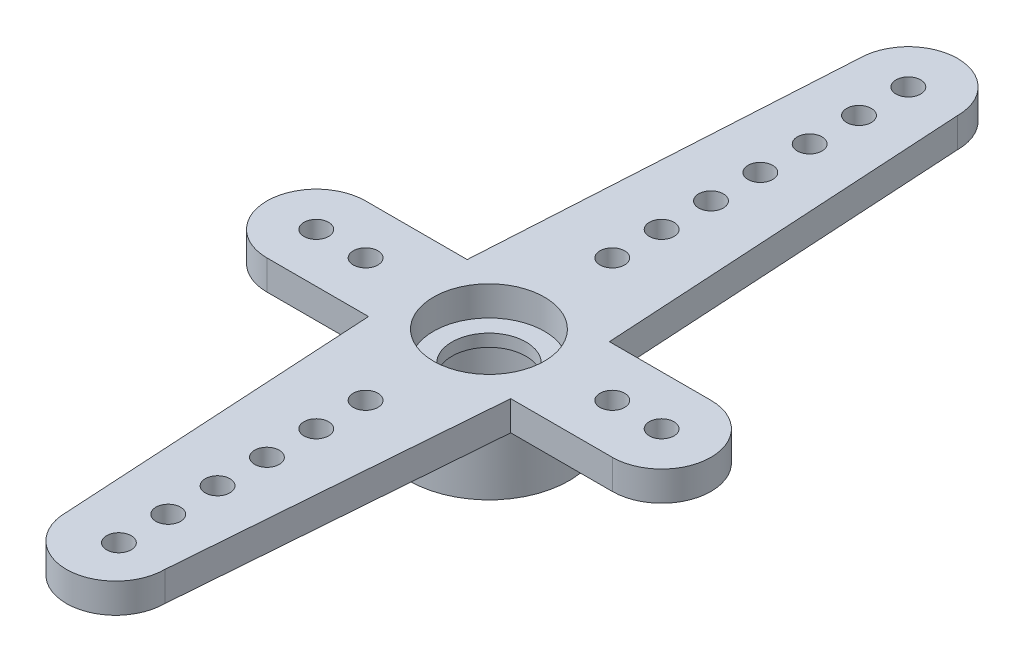
ISO-10303-21;
HEADER;
FILE_DESCRIPTION(('STEP AP214'),'2;1');
FILE_NAME('part.step','',(''),(''),'','','');
FILE_SCHEMA(('AUTOMOTIVE_DESIGN { 1 0 10303 214 1 1 1 1 }'));
ENDSEC;
DATA;
#1=APPLICATION_CONTEXT('core data for automotive mechanical design processes');
#2=APPLICATION_PROTOCOL_DEFINITION('international standard','automotive_design',2000,#1);
#3=PRODUCT_CONTEXT('',#1,'mechanical');
#4=PRODUCT('Part','Part','',(#3));
#5=PRODUCT_RELATED_PRODUCT_CATEGORY('part','',(#4));
#6=PRODUCT_DEFINITION_FORMATION('','',#4);
#7=PRODUCT_DEFINITION_CONTEXT('part definition',#1,'design');
#8=PRODUCT_DEFINITION('design','',#6,#7);
#9=PRODUCT_DEFINITION_SHAPE('','',#8);
#10=(LENGTH_UNIT() NAMED_UNIT(*) SI_UNIT(.MILLI.,.METRE.));
#11=(NAMED_UNIT(*) PLANE_ANGLE_UNIT() SI_UNIT($,.RADIAN.));
#12=(NAMED_UNIT(*) SI_UNIT($,.STERADIAN.) SOLID_ANGLE_UNIT());
#13=UNCERTAINTY_MEASURE_WITH_UNIT(LENGTH_MEASURE(1.E-05),#10,'distance_accuracy_value','');
#14=(GEOMETRIC_REPRESENTATION_CONTEXT(3) GLOBAL_UNCERTAINTY_ASSIGNED_CONTEXT((#13)) GLOBAL_UNIT_ASSIGNED_CONTEXT((#10,
#11,#12)) REPRESENTATION_CONTEXT('',''));
#15=CARTESIAN_POINT('',(0.,0.,0.));
#16=DIRECTION('',(0.,0.,1.));
#17=DIRECTION('',(1.,0.,0.));
#18=AXIS2_PLACEMENT_3D('',#15,#16,#17);
#19=CARTESIAN_POINT('',(0.,-2.5,0.));
#20=DIRECTION('',(0.,1.,0.));
#21=DIRECTION('',(0.,0.,1.));
#22=AXIS2_PLACEMENT_3D('',#19,#20,#21);
#23=CYLINDRICAL_SURFACE('',#22,1.5);
#24=CARTESIAN_POINT('',(0.,0.,0.));
#25=DIRECTION('',(0.,1.,0.));
#26=DIRECTION('',(0.,0.,1.));
#27=AXIS2_PLACEMENT_3D('',#24,#25,#26);
#28=CIRCLE('',#27,1.5);
#29=CARTESIAN_POINT('',(0.,0.,1.5));
#30=VERTEX_POINT('',#29);
#31=EDGE_CURVE('E665',#30,#30,#28,.T.);
#32=ORIENTED_EDGE('',*,*,#31,.T.);
#33=EDGE_LOOP('',(#32));
#34=FACE_BOUND('',#33,.T.);
#35=CARTESIAN_POINT('',(0.,-0.5,0.));
#36=DIRECTION('',(0.,-1.,0.));
#37=DIRECTION('',(0.,0.,-1.));
#38=AXIS2_PLACEMENT_3D('',#35,#36,#37);
#39=CIRCLE('',#38,1.5);
#40=CARTESIAN_POINT('',(0.,-0.5,-1.5));
#41=VERTEX_POINT('',#40);
#42=EDGE_CURVE('E43',#41,#41,#39,.F.);
#43=ORIENTED_EDGE('',*,*,#42,.F.);
#44=EDGE_LOOP('',(#43));
#45=FACE_BOUND('',#44,.T.);
#46=ADVANCED_FACE('F39',(#34,#45),#23,.F.);
#47=CARTESIAN_POINT('',(-0.132352941176372,1.2,14.9994160785999));
#48=DIRECTION('',(0.,-1.,0.));
#49=DIRECTION('',(0.,0.,-1.));
#50=AXIS2_PLACEMENT_3D('',#47,#48,#49);
#51=PLANE('',#50);
#52=CARTESIAN_POINT('',(-0.132352941176372,1.2,14.9994160785999));
#53=DIRECTION('',(0.,1.,0.));
#54=DIRECTION('',(0.,0.,-1.));
#55=AXIS2_PLACEMENT_3D('',#52,#53,#54);
#56=CIRCLE('',#55,2.);
#57=CARTESIAN_POINT('',(-2.13235294117637,1.2,14.9994160745409));
#58=VERTEX_POINT('',#57);
#59=CARTESIAN_POINT('',(1.86764698383597,1.2,14.999963756091));
#60=VERTEX_POINT('',#59);
#61=EDGE_CURVE('E203',#58,#60,#56,.T.);
#62=ORIENTED_EDGE('',*,*,#61,.T.);
#63=DIRECTION('',(0.0778178291031486,0.,-0.996967594996785));
#64=VECTOR('',#63,1.);
#65=CARTESIAN_POINT('',(2.88235294117642,1.2,2.));
#66=LINE('',#65,#64);
#67=CARTESIAN_POINT('',(2.88235294117642,1.2,2.));
#68=VERTEX_POINT('',#67);
#69=EDGE_CURVE('E114',#60,#68,#66,.T.);
#70=ORIENTED_EDGE('',*,*,#69,.T.);
#71=DIRECTION('',(1.,0.,0.));
#72=VECTOR('',#71,1.);
#73=CARTESIAN_POINT('',(2.88235294117642,1.2,2.));
#74=LINE('',#73,#72);
#75=CARTESIAN_POINT('',(7.,1.2,2.));
#76=VERTEX_POINT('',#75);
#77=EDGE_CURVE('E262',#68,#76,#74,.T.);
#78=ORIENTED_EDGE('',*,*,#77,.T.);
#79=CARTESIAN_POINT('',(7.,1.2,0.));
#80=DIRECTION('',(0.,1.,0.));
#81=DIRECTION('',(0.,0.,1.));
#82=AXIS2_PLACEMENT_3D('',#79,#80,#81);
#83=CIRCLE('',#82,2.);
#84=CARTESIAN_POINT('',(7.,1.2,-2.));
#85=VERTEX_POINT('',#84);
#86=EDGE_CURVE('E258',#76,#85,#83,.T.);
#87=ORIENTED_EDGE('',*,*,#86,.T.);
#88=DIRECTION('',(-1.,0.,0.));
#89=VECTOR('',#88,1.);
#90=CARTESIAN_POINT('',(2.88235294117642,1.2,-1.99999999999999));
#91=LINE('',#90,#89);
#92=CARTESIAN_POINT('',(2.88235294117642,1.2,-1.99999999999999));
#93=VERTEX_POINT('',#92);
#94=EDGE_CURVE('E261',#85,#93,#91,.T.);
#95=ORIENTED_EDGE('',*,*,#94,.T.);
#96=DIRECTION('',(-0.0587220219514669,0.,-0.998274373174996));
#97=VECTOR('',#96,1.);
#98=CARTESIAN_POINT('',(2.88235294117642,1.2,-1.99999999999999));
#99=LINE('',#98,#97);
#100=CARTESIAN_POINT('',(2.,1.2,-17.));
#101=VERTEX_POINT('',#100);
#102=EDGE_CURVE('E266',#93,#101,#99,.T.);
#103=ORIENTED_EDGE('',*,*,#102,.T.);
#104=CARTESIAN_POINT('',(0.,1.2,-17.));
#105=DIRECTION('',(0.,1.,0.));
#106=DIRECTION('',(0.,0.,1.));
#107=AXIS2_PLACEMENT_3D('',#104,#105,#106);
#108=CIRCLE('',#107,2.);
#109=CARTESIAN_POINT('',(-2.,1.2,-17.0000000001417));
#110=VERTEX_POINT('',#109);
#111=EDGE_CURVE('E273',#101,#110,#108,.T.);
#112=ORIENTED_EDGE('',*,*,#111,.T.);
#113=DIRECTION('',(-0.0587220219509209,0.,0.998274373175028));
#114=VECTOR('',#113,1.);
#115=CARTESIAN_POINT('',(-2.88235294117652,1.2,-2.));
#116=LINE('',#115,#114);
#117=CARTESIAN_POINT('',(-2.88235294117652,1.2,-2.));
#118=VERTEX_POINT('',#117);
#119=EDGE_CURVE('E276',#110,#118,#116,.T.);
#120=ORIENTED_EDGE('',*,*,#119,.T.);
#121=DIRECTION('',(-1.,0.,0.));
#122=VECTOR('',#121,1.);
#123=CARTESIAN_POINT('',(-2.88235294117652,1.2,-2.));
#124=LINE('',#123,#122);
#125=CARTESIAN_POINT('',(-7.,1.2,-2.));
#126=VERTEX_POINT('',#125);
#127=EDGE_CURVE('E146',#118,#126,#124,.T.);
#128=ORIENTED_EDGE('',*,*,#127,.T.);
#129=CARTESIAN_POINT('',(-7.,1.2,0.));
#130=DIRECTION('',(0.,1.,0.));
#131=DIRECTION('',(0.,0.,-1.));
#132=AXIS2_PLACEMENT_3D('',#129,#130,#131);
#133=CIRCLE('',#132,2.);
#134=CARTESIAN_POINT('',(-7.,1.2,2.));
#135=VERTEX_POINT('',#134);
#136=EDGE_CURVE('E139',#126,#135,#133,.T.);
#137=ORIENTED_EDGE('',*,*,#136,.T.);
#138=DIRECTION('',(1.,0.,0.));
#139=VECTOR('',#138,1.);
#140=CARTESIAN_POINT('',(-2.88235294117642,1.2,2.));
#141=LINE('',#140,#139);
#142=CARTESIAN_POINT('',(-2.88235294117642,1.2,2.));
#143=VERTEX_POINT('',#142);
#144=EDGE_CURVE('E144',#135,#143,#141,.T.);
#145=ORIENTED_EDGE('',*,*,#144,.T.);
#146=DIRECTION('',(0.0575991137129555,0.,0.998339792905943));
#147=VECTOR('',#146,1.);
#148=CARTESIAN_POINT('',(-2.88235294117642,1.2,2.));
#149=LINE('',#148,#147);
#150=EDGE_CURVE('E58',#143,#58,#149,.T.);
#151=ORIENTED_EDGE('',*,*,#150,.T.);
#152=EDGE_LOOP('',(#62,#70,#78,#87,#95,#103,#112,#120,#128,#137,#145,#151));
#153=FACE_BOUND('',#152,.T.);
#154=CARTESIAN_POINT('',(0.,1.2,-5.));
#155=DIRECTION('',(0.,1.,0.));
#156=DIRECTION('',(0.,0.,1.));
#157=AXIS2_PLACEMENT_3D('',#154,#155,#156);
#158=CIRCLE('',#157,0.5);
#159=CARTESIAN_POINT('',(0.,1.2,-4.5));
#160=VERTEX_POINT('',#159);
#161=EDGE_CURVE('E173',#160,#160,#158,.T.);
#162=ORIENTED_EDGE('',*,*,#161,.F.);
#163=EDGE_LOOP('',(#162));
#164=FACE_BOUND('',#163,.T.);
#165=CARTESIAN_POINT('',(0.,1.2,-7.));
#166=DIRECTION('',(0.,1.,0.));
#167=DIRECTION('',(0.,0.,1.));
#168=AXIS2_PLACEMENT_3D('',#165,#166,#167);
#169=CIRCLE('',#168,0.5);
#170=CARTESIAN_POINT('',(0.,1.2,-6.5));
#171=VERTEX_POINT('',#170);
#172=EDGE_CURVE('E801',#171,#171,#169,.T.);
#173=ORIENTED_EDGE('',*,*,#172,.F.);
#174=EDGE_LOOP('',(#173));
#175=FACE_BOUND('',#174,.T.);
#176=CARTESIAN_POINT('',(0.,1.2,-9.));
#177=DIRECTION('',(0.,1.,0.));
#178=DIRECTION('',(0.,0.,1.));
#179=AXIS2_PLACEMENT_3D('',#176,#177,#178);
#180=CIRCLE('',#179,0.5);
#181=CARTESIAN_POINT('',(0.,1.2,-8.5));
#182=VERTEX_POINT('',#181);
#183=EDGE_CURVE('E793',#182,#182,#180,.T.);
#184=ORIENTED_EDGE('',*,*,#183,.F.);
#185=EDGE_LOOP('',(#184));
#186=FACE_BOUND('',#185,.T.);
#187=CARTESIAN_POINT('',(0.,1.2,-11.));
#188=DIRECTION('',(0.,1.,0.));
#189=DIRECTION('',(0.,0.,1.));
#190=AXIS2_PLACEMENT_3D('',#187,#188,#189);
#191=CIRCLE('',#190,0.5);
#192=CARTESIAN_POINT('',(0.,1.2,-10.5));
#193=VERTEX_POINT('',#192);
#194=EDGE_CURVE('E785',#193,#193,#191,.T.);
#195=ORIENTED_EDGE('',*,*,#194,.F.);
#196=EDGE_LOOP('',(#195));
#197=FACE_BOUND('',#196,.T.);
#198=CARTESIAN_POINT('',(0.,1.2,-13.));
#199=DIRECTION('',(0.,1.,0.));
#200=DIRECTION('',(0.,0.,1.));
#201=AXIS2_PLACEMENT_3D('',#198,#199,#200);
#202=CIRCLE('',#201,0.5);
#203=CARTESIAN_POINT('',(0.,1.2,-12.5));
#204=VERTEX_POINT('',#203);
#205=EDGE_CURVE('E777',#204,#204,#202,.T.);
#206=ORIENTED_EDGE('',*,*,#205,.F.);
#207=EDGE_LOOP('',(#206));
#208=FACE_BOUND('',#207,.T.);
#209=CARTESIAN_POINT('',(0.,1.2,-15.));
#210=DIRECTION('',(0.,1.,0.));
#211=DIRECTION('',(0.,0.,1.));
#212=AXIS2_PLACEMENT_3D('',#209,#210,#211);
#213=CIRCLE('',#212,0.5);
#214=CARTESIAN_POINT('',(0.,1.2,-14.5));
#215=VERTEX_POINT('',#214);
#216=EDGE_CURVE('E769',#215,#215,#213,.T.);
#217=ORIENTED_EDGE('',*,*,#216,.F.);
#218=EDGE_LOOP('',(#217));
#219=FACE_BOUND('',#218,.T.);
#220=CARTESIAN_POINT('',(0.,1.2,-17.));
#221=DIRECTION('',(0.,1.,0.));
#222=DIRECTION('',(0.,0.,1.));
#223=AXIS2_PLACEMENT_3D('',#220,#221,#222);
#224=CIRCLE('',#223,0.5);
#225=CARTESIAN_POINT('',(0.,1.2,-16.5));
#226=VERTEX_POINT('',#225);
#227=EDGE_CURVE('E761',#226,#226,#224,.T.);
#228=ORIENTED_EDGE('',*,*,#227,.F.);
#229=EDGE_LOOP('',(#228));
#230=FACE_BOUND('',#229,.T.);
#231=CARTESIAN_POINT('',(0.,1.2,15.));
#232=DIRECTION('',(0.,1.,0.));
#233=DIRECTION('',(0.,0.,-1.));
#234=AXIS2_PLACEMENT_3D('',#231,#232,#233);
#235=CIRCLE('',#234,0.5);
#236=CARTESIAN_POINT('',(0.,1.2,14.5));
#237=VERTEX_POINT('',#236);
#238=EDGE_CURVE('E753',#237,#237,#235,.T.);
#239=ORIENTED_EDGE('',*,*,#238,.F.);
#240=EDGE_LOOP('',(#239));
#241=FACE_BOUND('',#240,.T.);
#242=CARTESIAN_POINT('',(0.,1.2,13.));
#243=DIRECTION('',(0.,1.,0.));
#244=DIRECTION('',(0.,0.,-1.));
#245=AXIS2_PLACEMENT_3D('',#242,#243,#244);
#246=CIRCLE('',#245,0.5);
#247=CARTESIAN_POINT('',(0.,1.2,12.5));
#248=VERTEX_POINT('',#247);
#249=EDGE_CURVE('E745',#248,#248,#246,.T.);
#250=ORIENTED_EDGE('',*,*,#249,.F.);
#251=EDGE_LOOP('',(#250));
#252=FACE_BOUND('',#251,.T.);
#253=CARTESIAN_POINT('',(0.,1.2,11.));
#254=DIRECTION('',(0.,1.,0.));
#255=DIRECTION('',(0.,0.,-1.));
#256=AXIS2_PLACEMENT_3D('',#253,#254,#255);
#257=CIRCLE('',#256,0.5);
#258=CARTESIAN_POINT('',(0.,1.2,10.5));
#259=VERTEX_POINT('',#258);
#260=EDGE_CURVE('E737',#259,#259,#257,.T.);
#261=ORIENTED_EDGE('',*,*,#260,.F.);
#262=EDGE_LOOP('',(#261));
#263=FACE_BOUND('',#262,.T.);
#264=CARTESIAN_POINT('',(0.,1.2,9.));
#265=DIRECTION('',(0.,1.,0.));
#266=DIRECTION('',(0.,0.,-1.));
#267=AXIS2_PLACEMENT_3D('',#264,#265,#266);
#268=CIRCLE('',#267,0.5);
#269=CARTESIAN_POINT('',(0.,1.2,8.5));
#270=VERTEX_POINT('',#269);
#271=EDGE_CURVE('E729',#270,#270,#268,.T.);
#272=ORIENTED_EDGE('',*,*,#271,.F.);
#273=EDGE_LOOP('',(#272));
#274=FACE_BOUND('',#273,.T.);
#275=CARTESIAN_POINT('',(0.,1.2,7.));
#276=DIRECTION('',(0.,1.,0.));
#277=DIRECTION('',(0.,0.,-1.));
#278=AXIS2_PLACEMENT_3D('',#275,#276,#277);
#279=CIRCLE('',#278,0.5);
#280=CARTESIAN_POINT('',(0.,1.2,6.5));
#281=VERTEX_POINT('',#280);
#282=EDGE_CURVE('E721',#281,#281,#279,.T.);
#283=ORIENTED_EDGE('',*,*,#282,.F.);
#284=EDGE_LOOP('',(#283));
#285=FACE_BOUND('',#284,.T.);
#286=CARTESIAN_POINT('',(0.,1.2,5.));
#287=DIRECTION('',(0.,1.,0.));
#288=DIRECTION('',(0.,0.,-1.));
#289=AXIS2_PLACEMENT_3D('',#286,#287,#288);
#290=CIRCLE('',#289,0.5);
#291=CARTESIAN_POINT('',(0.,1.2,4.5));
#292=VERTEX_POINT('',#291);
#293=EDGE_CURVE('E713',#292,#292,#290,.T.);
#294=ORIENTED_EDGE('',*,*,#293,.F.);
#295=EDGE_LOOP('',(#294));
#296=FACE_BOUND('',#295,.T.);
#297=CARTESIAN_POINT('',(7.,1.2,0.));
#298=DIRECTION('',(0.,1.,0.));
#299=DIRECTION('',(0.,0.,1.));
#300=AXIS2_PLACEMENT_3D('',#297,#298,#299);
#301=CIRCLE('',#300,0.5);
#302=CARTESIAN_POINT('',(7.,1.2,0.5));
#303=VERTEX_POINT('',#302);
#304=EDGE_CURVE('E705',#303,#303,#301,.T.);
#305=ORIENTED_EDGE('',*,*,#304,.F.);
#306=EDGE_LOOP('',(#305));
#307=FACE_BOUND('',#306,.T.);
#308=CARTESIAN_POINT('',(5.,1.2,0.));
#309=DIRECTION('',(0.,1.,0.));
#310=DIRECTION('',(0.,0.,1.));
#311=AXIS2_PLACEMENT_3D('',#308,#309,#310);
#312=CIRCLE('',#311,0.500000000000001);
#313=CARTESIAN_POINT('',(5.,1.2,0.500000000000001));
#314=VERTEX_POINT('',#313);
#315=EDGE_CURVE('E697',#314,#314,#312,.T.);
#316=ORIENTED_EDGE('',*,*,#315,.F.);
#317=EDGE_LOOP('',(#316));
#318=FACE_BOUND('',#317,.T.);
#319=CARTESIAN_POINT('',(-5.,1.2,0.));
#320=DIRECTION('',(0.,1.,0.));
#321=DIRECTION('',(0.,0.,-1.));
#322=AXIS2_PLACEMENT_3D('',#319,#320,#321);
#323=CIRCLE('',#322,0.500000000000001);
#324=CARTESIAN_POINT('',(-5.,1.2,-0.500000000000001));
#325=VERTEX_POINT('',#324);
#326=EDGE_CURVE('E689',#325,#325,#323,.T.);
#327=ORIENTED_EDGE('',*,*,#326,.F.);
#328=EDGE_LOOP('',(#327));
#329=FACE_BOUND('',#328,.T.);
#330=CARTESIAN_POINT('',(-7.,1.2,0.));
#331=DIRECTION('',(0.,1.,0.));
#332=DIRECTION('',(0.,0.,-1.));
#333=AXIS2_PLACEMENT_3D('',#330,#331,#332);
#334=CIRCLE('',#333,0.5);
#335=CARTESIAN_POINT('',(-7.,1.2,-0.5));
#336=VERTEX_POINT('',#335);
#337=EDGE_CURVE('E681',#336,#336,#334,.T.);
#338=ORIENTED_EDGE('',*,*,#337,.F.);
#339=EDGE_LOOP('',(#338));
#340=FACE_BOUND('',#339,.T.);
#341=CARTESIAN_POINT('',(0.,1.2,0.));
#342=DIRECTION('',(0.,1.,0.));
#343=DIRECTION('',(0.,0.,1.));
#344=AXIS2_PLACEMENT_3D('',#341,#342,#343);
#345=CIRCLE('',#344,2.25);
#346=CARTESIAN_POINT('',(0.,1.2,2.25));
#347=VERTEX_POINT('',#346);
#348=EDGE_CURVE('E673',#347,#347,#345,.T.);
#349=ORIENTED_EDGE('',*,*,#348,.F.);
#350=EDGE_LOOP('',(#349));
#351=FACE_BOUND('',#350,.T.);
#352=ADVANCED_FACE('F141',(#153,#164,#175,#186,#197,#208,#219,#230,#241,#252,#263,#274,#285,
#296,#307,#318,#329,#340,#351),#51,.F.);
#353=CARTESIAN_POINT('',(-0.132352941176372,0.,14.9994160785999));
#354=DIRECTION('',(0.,-1.,0.));
#355=DIRECTION('',(0.,0.,-1.));
#356=AXIS2_PLACEMENT_3D('',#353,#354,#355);
#357=PLANE('',#356);
#358=CARTESIAN_POINT('',(0.,0.,0.));
#359=DIRECTION('',(0.,-1.,0.));
#360=DIRECTION('',(0.,0.,-1.));
#361=AXIS2_PLACEMENT_3D('',#358,#359,#360);
#362=CIRCLE('',#361,3.25);
#363=CARTESIAN_POINT('',(0.,0.,-3.25));
#364=VERTEX_POINT('',#363);
#365=EDGE_CURVE('E11',#364,#364,#362,.T.);
#366=ORIENTED_EDGE('',*,*,#365,.F.);
#367=EDGE_LOOP('',(#366));
#368=FACE_BOUND('',#367,.T.);
#369=CARTESIAN_POINT('',(-7.,0.,0.));
#370=DIRECTION('',(0.,1.,0.));
#371=DIRECTION('',(0.,0.,-1.));
#372=AXIS2_PLACEMENT_3D('',#369,#370,#371);
#373=CIRCLE('',#372,0.5);
#374=CARTESIAN_POINT('',(-7.,0.,-0.5));
#375=VERTEX_POINT('',#374);
#376=EDGE_CURVE('E677',#375,#375,#373,.T.);
#377=ORIENTED_EDGE('',*,*,#376,.T.);
#378=EDGE_LOOP('',(#377));
#379=FACE_BOUND('',#378,.T.);
#380=CARTESIAN_POINT('',(5.,0.,0.));
#381=DIRECTION('',(0.,1.,0.));
#382=DIRECTION('',(0.,0.,1.));
#383=AXIS2_PLACEMENT_3D('',#380,#381,#382);
#384=CIRCLE('',#383,0.500000000000001);
#385=CARTESIAN_POINT('',(5.,0.,0.500000000000001));
#386=VERTEX_POINT('',#385);
#387=EDGE_CURVE('E693',#386,#386,#384,.T.);
#388=ORIENTED_EDGE('',*,*,#387,.T.);
#389=EDGE_LOOP('',(#388));
#390=FACE_BOUND('',#389,.T.);
#391=CARTESIAN_POINT('',(0.,0.,5.));
#392=DIRECTION('',(0.,1.,0.));
#393=DIRECTION('',(0.,0.,-1.));
#394=AXIS2_PLACEMENT_3D('',#391,#392,#393);
#395=CIRCLE('',#394,0.5);
#396=CARTESIAN_POINT('',(0.,0.,4.5));
#397=VERTEX_POINT('',#396);
#398=EDGE_CURVE('E709',#397,#397,#395,.T.);
#399=ORIENTED_EDGE('',*,*,#398,.T.);
#400=EDGE_LOOP('',(#399));
#401=FACE_BOUND('',#400,.T.);
#402=CARTESIAN_POINT('',(0.,0.,9.));
#403=DIRECTION('',(0.,1.,0.));
#404=DIRECTION('',(0.,0.,-1.));
#405=AXIS2_PLACEMENT_3D('',#402,#403,#404);
#406=CIRCLE('',#405,0.5);
#407=CARTESIAN_POINT('',(0.,0.,8.5));
#408=VERTEX_POINT('',#407);
#409=EDGE_CURVE('E725',#408,#408,#406,.T.);
#410=ORIENTED_EDGE('',*,*,#409,.T.);
#411=EDGE_LOOP('',(#410));
#412=FACE_BOUND('',#411,.T.);
#413=CARTESIAN_POINT('',(0.,0.,13.));
#414=DIRECTION('',(0.,1.,0.));
#415=DIRECTION('',(0.,0.,-1.));
#416=AXIS2_PLACEMENT_3D('',#413,#414,#415);
#417=CIRCLE('',#416,0.5);
#418=CARTESIAN_POINT('',(0.,0.,12.5));
#419=VERTEX_POINT('',#418);
#420=EDGE_CURVE('E741',#419,#419,#417,.T.);
#421=ORIENTED_EDGE('',*,*,#420,.T.);
#422=EDGE_LOOP('',(#421));
#423=FACE_BOUND('',#422,.T.);
#424=CARTESIAN_POINT('',(0.,0.,-17.));
#425=DIRECTION('',(0.,1.,0.));
#426=DIRECTION('',(0.,0.,1.));
#427=AXIS2_PLACEMENT_3D('',#424,#425,#426);
#428=CIRCLE('',#427,0.5);
#429=CARTESIAN_POINT('',(0.,0.,-16.5));
#430=VERTEX_POINT('',#429);
#431=EDGE_CURVE('E757',#430,#430,#428,.T.);
#432=ORIENTED_EDGE('',*,*,#431,.T.);
#433=EDGE_LOOP('',(#432));
#434=FACE_BOUND('',#433,.T.);
#435=CARTESIAN_POINT('',(0.,0.,-13.));
#436=DIRECTION('',(0.,1.,0.));
#437=DIRECTION('',(0.,0.,1.));
#438=AXIS2_PLACEMENT_3D('',#435,#436,#437);
#439=CIRCLE('',#438,0.5);
#440=CARTESIAN_POINT('',(0.,0.,-12.5));
#441=VERTEX_POINT('',#440);
#442=EDGE_CURVE('E773',#441,#441,#439,.T.);
#443=ORIENTED_EDGE('',*,*,#442,.T.);
#444=EDGE_LOOP('',(#443));
#445=FACE_BOUND('',#444,.T.);
#446=CARTESIAN_POINT('',(0.,0.,-9.));
#447=DIRECTION('',(0.,1.,0.));
#448=DIRECTION('',(0.,0.,1.));
#449=AXIS2_PLACEMENT_3D('',#446,#447,#448);
#450=CIRCLE('',#449,0.5);
#451=CARTESIAN_POINT('',(0.,0.,-8.5));
#452=VERTEX_POINT('',#451);
#453=EDGE_CURVE('E789',#452,#452,#450,.T.);
#454=ORIENTED_EDGE('',*,*,#453,.T.);
#455=EDGE_LOOP('',(#454));
#456=FACE_BOUND('',#455,.T.);
#457=CARTESIAN_POINT('',(0.,0.,-5.));
#458=DIRECTION('',(0.,1.,0.));
#459=DIRECTION('',(0.,0.,1.));
#460=AXIS2_PLACEMENT_3D('',#457,#458,#459);
#461=CIRCLE('',#460,0.5);
#462=CARTESIAN_POINT('',(0.,0.,-4.5));
#463=VERTEX_POINT('',#462);
#464=EDGE_CURVE('E805',#463,#463,#461,.T.);
#465=ORIENTED_EDGE('',*,*,#464,.T.);
#466=EDGE_LOOP('',(#465));
#467=FACE_BOUND('',#466,.T.);
#468=CARTESIAN_POINT('',(-0.132352941176372,0.,14.9994160785999));
#469=DIRECTION('',(0.,1.,0.));
#470=DIRECTION('',(0.,0.,-1.));
#471=AXIS2_PLACEMENT_3D('',#468,#469,#470);
#472=CIRCLE('',#471,2.);
#473=CARTESIAN_POINT('',(-2.13235294117637,0.,14.9994160745409));
#474=VERTEX_POINT('',#473);
#475=CARTESIAN_POINT('',(1.86764698383597,0.,14.999963756091));
#476=VERTEX_POINT('',#475);
#477=EDGE_CURVE('E168',#474,#476,#472,.T.);
#478=ORIENTED_EDGE('',*,*,#477,.F.);
#479=DIRECTION('',(0.0575991137129555,0.,0.998339792905943));
#480=VECTOR('',#479,1.);
#481=CARTESIAN_POINT('',(-2.88235294117642,0.,2.));
#482=LINE('',#481,#480);
#483=CARTESIAN_POINT('',(-2.88235294117642,0.,2.));
#484=VERTEX_POINT('',#483);
#485=EDGE_CURVE('E105',#484,#474,#482,.T.);
#486=ORIENTED_EDGE('',*,*,#485,.F.);
#487=DIRECTION('',(1.,0.,0.));
#488=VECTOR('',#487,1.);
#489=CARTESIAN_POINT('',(-2.88235294117642,0.,2.));
#490=LINE('',#489,#488);
#491=CARTESIAN_POINT('',(-7.,0.,2.));
#492=VERTEX_POINT('',#491);
#493=EDGE_CURVE('E99',#492,#484,#490,.T.);
#494=ORIENTED_EDGE('',*,*,#493,.F.);
#495=CARTESIAN_POINT('',(-7.,0.,0.));
#496=DIRECTION('',(0.,1.,0.));
#497=DIRECTION('',(0.,0.,-1.));
#498=AXIS2_PLACEMENT_3D('',#495,#496,#497);
#499=CIRCLE('',#498,2.);
#500=CARTESIAN_POINT('',(-7.,0.,-2.));
#501=VERTEX_POINT('',#500);
#502=EDGE_CURVE('E155',#501,#492,#499,.T.);
#503=ORIENTED_EDGE('',*,*,#502,.F.);
#504=DIRECTION('',(-1.,0.,0.));
#505=VECTOR('',#504,1.);
#506=CARTESIAN_POINT('',(-2.88235294117652,0.,-2.));
#507=LINE('',#506,#505);
#508=CARTESIAN_POINT('',(-2.88235294117652,0.,-2.));
#509=VERTEX_POINT('',#508);
#510=EDGE_CURVE('E194',#509,#501,#507,.T.);
#511=ORIENTED_EDGE('',*,*,#510,.F.);
#512=DIRECTION('',(-0.0587220219509209,0.,0.998274373175028));
#513=VECTOR('',#512,1.);
#514=CARTESIAN_POINT('',(-2.88235294117652,0.,-2.));
#515=LINE('',#514,#513);
#516=CARTESIAN_POINT('',(-2.,0.,-17.0000000001417));
#517=VERTEX_POINT('',#516);
#518=EDGE_CURVE('E191',#517,#509,#515,.T.);
#519=ORIENTED_EDGE('',*,*,#518,.F.);
#520=CARTESIAN_POINT('',(0.,0.,-17.));
#521=DIRECTION('',(0.,1.,0.));
#522=DIRECTION('',(0.,0.,1.));
#523=AXIS2_PLACEMENT_3D('',#520,#521,#522);
#524=CIRCLE('',#523,2.);
#525=CARTESIAN_POINT('',(2.,0.,-17.));
#526=VERTEX_POINT('',#525);
#527=EDGE_CURVE('E188',#526,#517,#524,.T.);
#528=ORIENTED_EDGE('',*,*,#527,.F.);
#529=DIRECTION('',(-0.0587220219514669,0.,-0.998274373174996));
#530=VECTOR('',#529,1.);
#531=CARTESIAN_POINT('',(2.88235294117642,0.,-1.99999999999999));
#532=LINE('',#531,#530);
#533=CARTESIAN_POINT('',(2.88235294117642,0.,-1.99999999999999));
#534=VERTEX_POINT('',#533);
#535=EDGE_CURVE('E185',#534,#526,#532,.T.);
#536=ORIENTED_EDGE('',*,*,#535,.F.);
#537=DIRECTION('',(-1.,0.,0.));
#538=VECTOR('',#537,1.);
#539=CARTESIAN_POINT('',(2.88235294117642,0.,-1.99999999999999));
#540=LINE('',#539,#538);
#541=CARTESIAN_POINT('',(7.,0.,-2.));
#542=VERTEX_POINT('',#541);
#543=EDGE_CURVE('E182',#542,#534,#540,.T.);
#544=ORIENTED_EDGE('',*,*,#543,.F.);
#545=CARTESIAN_POINT('',(7.,0.,0.));
#546=DIRECTION('',(0.,1.,0.));
#547=DIRECTION('',(0.,0.,1.));
#548=AXIS2_PLACEMENT_3D('',#545,#546,#547);
#549=CIRCLE('',#548,2.);
#550=CARTESIAN_POINT('',(7.,0.,2.));
#551=VERTEX_POINT('',#550);
#552=EDGE_CURVE('E179',#551,#542,#549,.T.);
#553=ORIENTED_EDGE('',*,*,#552,.F.);
#554=DIRECTION('',(1.,0.,0.));
#555=VECTOR('',#554,1.);
#556=CARTESIAN_POINT('',(2.88235294117642,0.,2.));
#557=LINE('',#556,#555);
#558=CARTESIAN_POINT('',(2.88235294117642,0.,2.));
#559=VERTEX_POINT('',#558);
#560=EDGE_CURVE('E176',#559,#551,#557,.T.);
#561=ORIENTED_EDGE('',*,*,#560,.F.);
#562=DIRECTION('',(0.0778178291031486,0.,-0.996967594996785));
#563=VECTOR('',#562,1.);
#564=CARTESIAN_POINT('',(2.88235294117642,0.,2.));
#565=LINE('',#564,#563);
#566=EDGE_CURVE('E172',#476,#559,#565,.T.);
#567=ORIENTED_EDGE('',*,*,#566,.F.);
#568=EDGE_LOOP('',(#478,#486,#494,#503,#511,#519,#528,#536,#544,#553,#561,#567));
#569=FACE_BOUND('',#568,.T.);
#570=CARTESIAN_POINT('',(0.,0.,-7.));
#571=DIRECTION('',(0.,1.,0.));
#572=DIRECTION('',(0.,0.,1.));
#573=AXIS2_PLACEMENT_3D('',#570,#571,#572);
#574=CIRCLE('',#573,0.5);
#575=CARTESIAN_POINT('',(0.,0.,-6.5));
#576=VERTEX_POINT('',#575);
#577=EDGE_CURVE('E797',#576,#576,#574,.T.);
#578=ORIENTED_EDGE('',*,*,#577,.T.);
#579=EDGE_LOOP('',(#578));
#580=FACE_BOUND('',#579,.T.);
#581=CARTESIAN_POINT('',(0.,0.,-11.));
#582=DIRECTION('',(0.,1.,0.));
#583=DIRECTION('',(0.,0.,1.));
#584=AXIS2_PLACEMENT_3D('',#581,#582,#583);
#585=CIRCLE('',#584,0.5);
#586=CARTESIAN_POINT('',(0.,0.,-10.5));
#587=VERTEX_POINT('',#586);
#588=EDGE_CURVE('E781',#587,#587,#585,.T.);
#589=ORIENTED_EDGE('',*,*,#588,.T.);
#590=EDGE_LOOP('',(#589));
#591=FACE_BOUND('',#590,.T.);
#592=CARTESIAN_POINT('',(0.,0.,-15.));
#593=DIRECTION('',(0.,1.,0.));
#594=DIRECTION('',(0.,0.,1.));
#595=AXIS2_PLACEMENT_3D('',#592,#593,#594);
#596=CIRCLE('',#595,0.5);
#597=CARTESIAN_POINT('',(0.,0.,-14.5));
#598=VERTEX_POINT('',#597);
#599=EDGE_CURVE('E765',#598,#598,#596,.T.);
#600=ORIENTED_EDGE('',*,*,#599,.T.);
#601=EDGE_LOOP('',(#600));
#602=FACE_BOUND('',#601,.T.);
#603=CARTESIAN_POINT('',(0.,0.,15.));
#604=DIRECTION('',(0.,1.,0.));
#605=DIRECTION('',(0.,0.,-1.));
#606=AXIS2_PLACEMENT_3D('',#603,#604,#605);
#607=CIRCLE('',#606,0.5);
#608=CARTESIAN_POINT('',(0.,0.,14.5));
#609=VERTEX_POINT('',#608);
#610=EDGE_CURVE('E749',#609,#609,#607,.T.);
#611=ORIENTED_EDGE('',*,*,#610,.T.);
#612=EDGE_LOOP('',(#611));
#613=FACE_BOUND('',#612,.T.);
#614=CARTESIAN_POINT('',(0.,0.,11.));
#615=DIRECTION('',(0.,1.,0.));
#616=DIRECTION('',(0.,0.,-1.));
#617=AXIS2_PLACEMENT_3D('',#614,#615,#616);
#618=CIRCLE('',#617,0.5);
#619=CARTESIAN_POINT('',(0.,0.,10.5));
#620=VERTEX_POINT('',#619);
#621=EDGE_CURVE('E733',#620,#620,#618,.T.);
#622=ORIENTED_EDGE('',*,*,#621,.T.);
#623=EDGE_LOOP('',(#622));
#624=FACE_BOUND('',#623,.T.);
#625=CARTESIAN_POINT('',(0.,0.,7.));
#626=DIRECTION('',(0.,1.,0.));
#627=DIRECTION('',(0.,0.,-1.));
#628=AXIS2_PLACEMENT_3D('',#625,#626,#627);
#629=CIRCLE('',#628,0.5);
#630=CARTESIAN_POINT('',(0.,0.,6.5));
#631=VERTEX_POINT('',#630);
#632=EDGE_CURVE('E717',#631,#631,#629,.T.);
#633=ORIENTED_EDGE('',*,*,#632,.T.);
#634=EDGE_LOOP('',(#633));
#635=FACE_BOUND('',#634,.T.);
#636=CARTESIAN_POINT('',(7.,0.,0.));
#637=DIRECTION('',(0.,1.,0.));
#638=DIRECTION('',(0.,0.,1.));
#639=AXIS2_PLACEMENT_3D('',#636,#637,#638);
#640=CIRCLE('',#639,0.5);
#641=CARTESIAN_POINT('',(7.,0.,0.5));
#642=VERTEX_POINT('',#641);
#643=EDGE_CURVE('E701',#642,#642,#640,.T.);
#644=ORIENTED_EDGE('',*,*,#643,.T.);
#645=EDGE_LOOP('',(#644));
#646=FACE_BOUND('',#645,.T.);
#647=CARTESIAN_POINT('',(-5.,0.,0.));
#648=DIRECTION('',(0.,1.,0.));
#649=DIRECTION('',(0.,0.,-1.));
#650=AXIS2_PLACEMENT_3D('',#647,#648,#649);
#651=CIRCLE('',#650,0.500000000000001);
#652=CARTESIAN_POINT('',(-5.,0.,-0.500000000000001));
#653=VERTEX_POINT('',#652);
#654=EDGE_CURVE('E685',#653,#653,#651,.T.);
#655=ORIENTED_EDGE('',*,*,#654,.T.);
#656=EDGE_LOOP('',(#655));
#657=FACE_BOUND('',#656,.T.);
#658=ADVANCED_FACE('F245',(#368,#379,#390,#401,#412,#423,#434,#445,#456,#467,#569,#580,#591,
#602,#613,#624,#635,#646,#657),#357,.T.);
#659=CARTESIAN_POINT('',(-0.132352941176372,1.2,14.9994160785999));
#660=DIRECTION('',(0.,-1.,0.));
#661=DIRECTION('',(0.,0.,-1.));
#662=AXIS2_PLACEMENT_3D('',#659,#660,#661);
#663=CYLINDRICAL_SURFACE('',#662,2.);
#664=ORIENTED_EDGE('',*,*,#477,.T.);
#665=DIRECTION('',(0.,-1.,0.));
#666=VECTOR('',#665,1.);
#667=CARTESIAN_POINT('',(1.86764698383597,1.2,14.999963756091));
#668=LINE('',#667,#666);
#669=EDGE_CURVE('E50',#60,#476,#668,.T.);
#670=ORIENTED_EDGE('',*,*,#669,.F.);
#671=ORIENTED_EDGE('',*,*,#61,.F.);
#672=DIRECTION('',(0.,-1.,0.));
#673=VECTOR('',#672,1.);
#674=CARTESIAN_POINT('',(-2.13235294117637,1.2,14.9994160745409));
#675=LINE('',#674,#673);
#676=EDGE_CURVE('E164',#58,#474,#675,.T.);
#677=ORIENTED_EDGE('',*,*,#676,.T.);
#678=EDGE_LOOP('',(#664,#670,#671,#677));
#679=FACE_BOUND('',#678,.T.);
#680=ADVANCED_FACE('F41',(#679),#663,.T.);
#681=CARTESIAN_POINT('',(2.88235294117642,1.2,2.));
#682=DIRECTION('',(-0.996967594996785,0.,-0.0778178291031486));
#683=DIRECTION('',(-0.0778178291031486,0.,0.996967594996785));
#684=AXIS2_PLACEMENT_3D('',#681,#682,#683);
#685=PLANE('',#684);
#686=ORIENTED_EDGE('',*,*,#566,.T.);
#687=DIRECTION('',(0.,-1.,0.));
#688=VECTOR('',#687,1.);
#689=CARTESIAN_POINT('',(2.88235294117642,1.2,2.));
#690=LINE('',#689,#688);
#691=EDGE_CURVE('E234',#68,#559,#690,.T.);
#692=ORIENTED_EDGE('',*,*,#691,.F.);
#693=ORIENTED_EDGE('',*,*,#69,.F.);
#694=ORIENTED_EDGE('',*,*,#669,.T.);
#695=EDGE_LOOP('',(#686,#692,#693,#694));
#696=FACE_BOUND('',#695,.T.);
#697=ADVANCED_FACE('F240',(#696),#685,.F.);
#698=CARTESIAN_POINT('',(2.88235294117642,1.2,2.));
#699=DIRECTION('',(0.,0.,-1.));
#700=DIRECTION('',(-1.,0.,0.));
#701=AXIS2_PLACEMENT_3D('',#698,#699,#700);
#702=PLANE('',#701);
#703=ORIENTED_EDGE('',*,*,#560,.T.);
#704=DIRECTION('',(0.,-1.,0.));
#705=VECTOR('',#704,1.);
#706=CARTESIAN_POINT('',(7.,1.2,2.));
#707=LINE('',#706,#705);
#708=EDGE_CURVE('E230',#76,#551,#707,.T.);
#709=ORIENTED_EDGE('',*,*,#708,.F.);
#710=ORIENTED_EDGE('',*,*,#77,.F.);
#711=ORIENTED_EDGE('',*,*,#691,.T.);
#712=EDGE_LOOP('',(#703,#709,#710,#711));
#713=FACE_BOUND('',#712,.T.);
#714=ADVANCED_FACE('F252',(#713),#702,.F.);
#715=CARTESIAN_POINT('',(7.,1.2,0.));
#716=DIRECTION('',(0.,-1.,0.));
#717=DIRECTION('',(0.,0.,-1.));
#718=AXIS2_PLACEMENT_3D('',#715,#716,#717);
#719=CYLINDRICAL_SURFACE('',#718,2.);
#720=ORIENTED_EDGE('',*,*,#552,.T.);
#721=DIRECTION('',(0.,-1.,0.));
#722=VECTOR('',#721,1.);
#723=CARTESIAN_POINT('',(7.,1.2,-2.));
#724=LINE('',#723,#722);
#725=EDGE_CURVE('E226',#85,#542,#724,.T.);
#726=ORIENTED_EDGE('',*,*,#725,.F.);
#727=ORIENTED_EDGE('',*,*,#86,.F.);
#728=ORIENTED_EDGE('',*,*,#708,.T.);
#729=EDGE_LOOP('',(#720,#726,#727,#728));
#730=FACE_BOUND('',#729,.T.);
#731=ADVANCED_FACE('F256',(#730),#719,.T.);
#732=CARTESIAN_POINT('',(2.88235294117642,1.2,-1.99999999999999));
#733=DIRECTION('',(0.,0.,1.));
#734=DIRECTION('',(1.,0.,0.));
#735=AXIS2_PLACEMENT_3D('',#732,#733,#734);
#736=PLANE('',#735);
#737=ORIENTED_EDGE('',*,*,#543,.T.);
#738=DIRECTION('',(0.,-1.,0.));
#739=VECTOR('',#738,1.);
#740=CARTESIAN_POINT('',(2.88235294117642,1.2,-1.99999999999999));
#741=LINE('',#740,#739);
#742=EDGE_CURVE('E222',#93,#534,#741,.T.);
#743=ORIENTED_EDGE('',*,*,#742,.F.);
#744=ORIENTED_EDGE('',*,*,#94,.F.);
#745=ORIENTED_EDGE('',*,*,#725,.T.);
#746=EDGE_LOOP('',(#737,#743,#744,#745));
#747=FACE_BOUND('',#746,.T.);
#748=ADVANCED_FACE('F299',(#747),#736,.F.);
#749=CARTESIAN_POINT('',(2.88235294117642,1.2,-1.99999999999999));
#750=DIRECTION('',(-0.998274373174996,0.,0.0587220219514669));
#751=DIRECTION('',(0.0587220219514669,0.,0.998274373174996));
#752=AXIS2_PLACEMENT_3D('',#749,#750,#751);
#753=PLANE('',#752);
#754=ORIENTED_EDGE('',*,*,#535,.T.);
#755=DIRECTION('',(0.,-1.,0.));
#756=VECTOR('',#755,1.);
#757=CARTESIAN_POINT('',(2.,1.2,-17.));
#758=LINE('',#757,#756);
#759=EDGE_CURVE('E218',#101,#526,#758,.T.);
#760=ORIENTED_EDGE('',*,*,#759,.F.);
#761=ORIENTED_EDGE('',*,*,#102,.F.);
#762=ORIENTED_EDGE('',*,*,#742,.T.);
#763=EDGE_LOOP('',(#754,#760,#761,#762));
#764=FACE_BOUND('',#763,.T.);
#765=ADVANCED_FACE('F296',(#764),#753,.F.);
#766=CARTESIAN_POINT('',(0.,1.2,-17.));
#767=DIRECTION('',(0.,-1.,0.));
#768=DIRECTION('',(0.,0.,-1.));
#769=AXIS2_PLACEMENT_3D('',#766,#767,#768);
#770=CYLINDRICAL_SURFACE('',#769,2.);
#771=ORIENTED_EDGE('',*,*,#527,.T.);
#772=DIRECTION('',(0.,-1.,0.));
#773=VECTOR('',#772,1.);
#774=CARTESIAN_POINT('',(-2.,1.2,-17.0000000001417));
#775=LINE('',#774,#773);
#776=EDGE_CURVE('E214',#110,#517,#775,.T.);
#777=ORIENTED_EDGE('',*,*,#776,.F.);
#778=ORIENTED_EDGE('',*,*,#111,.F.);
#779=ORIENTED_EDGE('',*,*,#759,.T.);
#780=EDGE_LOOP('',(#771,#777,#778,#779));
#781=FACE_BOUND('',#780,.T.);
#782=ADVANCED_FACE('F292',(#781),#770,.T.);
#783=CARTESIAN_POINT('',(-2.88235294117652,1.2,-2.));
#784=DIRECTION('',(0.998274373175028,0.,0.0587220219509209));
#785=DIRECTION('',(0.0587220219509209,0.,-0.998274373175028));
#786=AXIS2_PLACEMENT_3D('',#783,#784,#785);
#787=PLANE('',#786);
#788=ORIENTED_EDGE('',*,*,#518,.T.);
#789=DIRECTION('',(0.,-1.,0.));
#790=VECTOR('',#789,1.);
#791=CARTESIAN_POINT('',(-2.88235294117652,1.2,-2.));
#792=LINE('',#791,#790);
#793=EDGE_CURVE('E210',#118,#509,#792,.T.);
#794=ORIENTED_EDGE('',*,*,#793,.F.);
#795=ORIENTED_EDGE('',*,*,#119,.F.);
#796=ORIENTED_EDGE('',*,*,#776,.T.);
#797=EDGE_LOOP('',(#788,#794,#795,#796));
#798=FACE_BOUND('',#797,.T.);
#799=ADVANCED_FACE('F284',(#798),#787,.F.);
#800=CARTESIAN_POINT('',(-2.88235294117652,1.2,-2.));
#801=DIRECTION('',(0.,0.,1.));
#802=DIRECTION('',(1.,0.,0.));
#803=AXIS2_PLACEMENT_3D('',#800,#801,#802);
#804=PLANE('',#803);
#805=ORIENTED_EDGE('',*,*,#510,.T.);
#806=DIRECTION('',(0.,-1.,0.));
#807=VECTOR('',#806,1.);
#808=CARTESIAN_POINT('',(-7.,1.2,-2.));
#809=LINE('',#808,#807);
#810=EDGE_CURVE('E157',#126,#501,#809,.T.);
#811=ORIENTED_EDGE('',*,*,#810,.F.);
#812=ORIENTED_EDGE('',*,*,#127,.F.);
#813=ORIENTED_EDGE('',*,*,#793,.T.);
#814=EDGE_LOOP('',(#805,#811,#812,#813));
#815=FACE_BOUND('',#814,.T.);
#816=ADVANCED_FACE('F288',(#815),#804,.F.);
#817=CARTESIAN_POINT('',(-7.,1.2,0.));
#818=DIRECTION('',(0.,-1.,0.));
#819=DIRECTION('',(0.,0.,-1.));
#820=AXIS2_PLACEMENT_3D('',#817,#818,#819);
#821=CYLINDRICAL_SURFACE('',#820,2.);
#822=ORIENTED_EDGE('',*,*,#502,.T.);
#823=DIRECTION('',(0.,-1.,0.));
#824=VECTOR('',#823,1.);
#825=CARTESIAN_POINT('',(-7.,1.2,2.));
#826=LINE('',#825,#824);
#827=EDGE_CURVE('E152',#135,#492,#826,.T.);
#828=ORIENTED_EDGE('',*,*,#827,.F.);
#829=ORIENTED_EDGE('',*,*,#136,.F.);
#830=ORIENTED_EDGE('',*,*,#810,.T.);
#831=EDGE_LOOP('',(#822,#828,#829,#830));
#832=FACE_BOUND('',#831,.T.);
#833=ADVANCED_FACE('F153',(#832),#821,.T.);
#834=CARTESIAN_POINT('',(-2.88235294117642,1.2,2.));
#835=DIRECTION('',(0.,0.,-1.));
#836=DIRECTION('',(-1.,0.,0.));
#837=AXIS2_PLACEMENT_3D('',#834,#835,#836);
#838=PLANE('',#837);
#839=ORIENTED_EDGE('',*,*,#493,.T.);
#840=DIRECTION('',(0.,-1.,0.));
#841=VECTOR('',#840,1.);
#842=CARTESIAN_POINT('',(-2.88235294117642,1.2,2.));
#843=LINE('',#842,#841);
#844=EDGE_CURVE('E158',#143,#484,#843,.T.);
#845=ORIENTED_EDGE('',*,*,#844,.F.);
#846=ORIENTED_EDGE('',*,*,#144,.F.);
#847=ORIENTED_EDGE('',*,*,#827,.T.);
#848=EDGE_LOOP('',(#839,#845,#846,#847));
#849=FACE_BOUND('',#848,.T.);
#850=ADVANCED_FACE('F160',(#849),#838,.F.);
#851=CARTESIAN_POINT('',(-2.88235294117642,1.2,2.));
#852=DIRECTION('',(0.998339792905943,0.,-0.0575991137129555));
#853=DIRECTION('',(-0.0575991137129555,0.,-0.998339792905944));
#854=AXIS2_PLACEMENT_3D('',#851,#852,#853);
#855=PLANE('',#854);
#856=ORIENTED_EDGE('',*,*,#485,.T.);
#857=ORIENTED_EDGE('',*,*,#676,.F.);
#858=ORIENTED_EDGE('',*,*,#150,.F.);
#859=ORIENTED_EDGE('',*,*,#844,.T.);
#860=EDGE_LOOP('',(#856,#857,#858,#859));
#861=FACE_BOUND('',#860,.T.);
#862=ADVANCED_FACE('F404',(#861),#855,.F.);
#863=CARTESIAN_POINT('',(0.,1.2,-5.));
#864=DIRECTION('',(0.,-1.,0.));
#865=DIRECTION('',(0.,0.,-1.));
#866=AXIS2_PLACEMENT_3D('',#863,#864,#865);
#867=CYLINDRICAL_SURFACE('',#866,0.5);
#868=ORIENTED_EDGE('',*,*,#161,.T.);
#869=EDGE_LOOP('',(#868));
#870=FACE_BOUND('',#869,.T.);
#871=ORIENTED_EDGE('',*,*,#464,.F.);
#872=EDGE_LOOP('',(#871));
#873=FACE_BOUND('',#872,.T.);
#874=ADVANCED_FACE('F401',(#870,#873),#867,.F.);
#875=CARTESIAN_POINT('',(0.,1.2,-7.));
#876=DIRECTION('',(0.,-1.,0.));
#877=DIRECTION('',(0.,0.,-1.));
#878=AXIS2_PLACEMENT_3D('',#875,#876,#877);
#879=CYLINDRICAL_SURFACE('',#878,0.5);
#880=ORIENTED_EDGE('',*,*,#172,.T.);
#881=EDGE_LOOP('',(#880));
#882=FACE_BOUND('',#881,.T.);
#883=ORIENTED_EDGE('',*,*,#577,.F.);
#884=EDGE_LOOP('',(#883));
#885=FACE_BOUND('',#884,.T.);
#886=ADVANCED_FACE('F397',(#882,#885),#879,.F.);
#887=CARTESIAN_POINT('',(0.,1.2,-9.));
#888=DIRECTION('',(0.,-1.,0.));
#889=DIRECTION('',(0.,0.,-1.));
#890=AXIS2_PLACEMENT_3D('',#887,#888,#889);
#891=CYLINDRICAL_SURFACE('',#890,0.5);
#892=ORIENTED_EDGE('',*,*,#183,.T.);
#893=EDGE_LOOP('',(#892));
#894=FACE_BOUND('',#893,.T.);
#895=ORIENTED_EDGE('',*,*,#453,.F.);
#896=EDGE_LOOP('',(#895));
#897=FACE_BOUND('',#896,.T.);
#898=ADVANCED_FACE('F393',(#894,#897),#891,.F.);
#899=CARTESIAN_POINT('',(0.,1.2,-11.));
#900=DIRECTION('',(0.,-1.,0.));
#901=DIRECTION('',(0.,0.,-1.));
#902=AXIS2_PLACEMENT_3D('',#899,#900,#901);
#903=CYLINDRICAL_SURFACE('',#902,0.5);
#904=ORIENTED_EDGE('',*,*,#194,.T.);
#905=EDGE_LOOP('',(#904));
#906=FACE_BOUND('',#905,.T.);
#907=ORIENTED_EDGE('',*,*,#588,.F.);
#908=EDGE_LOOP('',(#907));
#909=FACE_BOUND('',#908,.T.);
#910=ADVANCED_FACE('F389',(#906,#909),#903,.F.);
#911=CARTESIAN_POINT('',(0.,1.2,-13.));
#912=DIRECTION('',(0.,-1.,0.));
#913=DIRECTION('',(0.,0.,-1.));
#914=AXIS2_PLACEMENT_3D('',#911,#912,#913);
#915=CYLINDRICAL_SURFACE('',#914,0.5);
#916=ORIENTED_EDGE('',*,*,#205,.T.);
#917=EDGE_LOOP('',(#916));
#918=FACE_BOUND('',#917,.T.);
#919=ORIENTED_EDGE('',*,*,#442,.F.);
#920=EDGE_LOOP('',(#919));
#921=FACE_BOUND('',#920,.T.);
#922=ADVANCED_FACE('F385',(#918,#921),#915,.F.);
#923=CARTESIAN_POINT('',(0.,1.2,-15.));
#924=DIRECTION('',(0.,-1.,0.));
#925=DIRECTION('',(0.,0.,-1.));
#926=AXIS2_PLACEMENT_3D('',#923,#924,#925);
#927=CYLINDRICAL_SURFACE('',#926,0.5);
#928=ORIENTED_EDGE('',*,*,#216,.T.);
#929=EDGE_LOOP('',(#928));
#930=FACE_BOUND('',#929,.T.);
#931=ORIENTED_EDGE('',*,*,#599,.F.);
#932=EDGE_LOOP('',(#931));
#933=FACE_BOUND('',#932,.T.);
#934=ADVANCED_FACE('F381',(#930,#933),#927,.F.);
#935=CARTESIAN_POINT('',(0.,1.2,-17.));
#936=DIRECTION('',(0.,-1.,0.));
#937=DIRECTION('',(0.,0.,-1.));
#938=AXIS2_PLACEMENT_3D('',#935,#936,#937);
#939=CYLINDRICAL_SURFACE('',#938,0.5);
#940=ORIENTED_EDGE('',*,*,#227,.T.);
#941=EDGE_LOOP('',(#940));
#942=FACE_BOUND('',#941,.T.);
#943=ORIENTED_EDGE('',*,*,#431,.F.);
#944=EDGE_LOOP('',(#943));
#945=FACE_BOUND('',#944,.T.);
#946=ADVANCED_FACE('F377',(#942,#945),#939,.F.);
#947=CARTESIAN_POINT('',(0.,1.2,15.));
#948=DIRECTION('',(0.,-1.,0.));
#949=DIRECTION('',(0.,0.,-1.));
#950=AXIS2_PLACEMENT_3D('',#947,#948,#949);
#951=CYLINDRICAL_SURFACE('',#950,0.5);
#952=ORIENTED_EDGE('',*,*,#238,.T.);
#953=EDGE_LOOP('',(#952));
#954=FACE_BOUND('',#953,.T.);
#955=ORIENTED_EDGE('',*,*,#610,.F.);
#956=EDGE_LOOP('',(#955));
#957=FACE_BOUND('',#956,.T.);
#958=ADVANCED_FACE('F373',(#954,#957),#951,.F.);
#959=CARTESIAN_POINT('',(0.,1.2,13.));
#960=DIRECTION('',(0.,-1.,0.));
#961=DIRECTION('',(0.,0.,-1.));
#962=AXIS2_PLACEMENT_3D('',#959,#960,#961);
#963=CYLINDRICAL_SURFACE('',#962,0.5);
#964=ORIENTED_EDGE('',*,*,#249,.T.);
#965=EDGE_LOOP('',(#964));
#966=FACE_BOUND('',#965,.T.);
#967=ORIENTED_EDGE('',*,*,#420,.F.);
#968=EDGE_LOOP('',(#967));
#969=FACE_BOUND('',#968,.T.);
#970=ADVANCED_FACE('F369',(#966,#969),#963,.F.);
#971=CARTESIAN_POINT('',(0.,1.2,11.));
#972=DIRECTION('',(0.,-1.,0.));
#973=DIRECTION('',(0.,0.,-1.));
#974=AXIS2_PLACEMENT_3D('',#971,#972,#973);
#975=CYLINDRICAL_SURFACE('',#974,0.5);
#976=ORIENTED_EDGE('',*,*,#260,.T.);
#977=EDGE_LOOP('',(#976));
#978=FACE_BOUND('',#977,.T.);
#979=ORIENTED_EDGE('',*,*,#621,.F.);
#980=EDGE_LOOP('',(#979));
#981=FACE_BOUND('',#980,.T.);
#982=ADVANCED_FACE('F365',(#978,#981),#975,.F.);
#983=CARTESIAN_POINT('',(0.,1.2,9.));
#984=DIRECTION('',(0.,-1.,0.));
#985=DIRECTION('',(0.,0.,-1.));
#986=AXIS2_PLACEMENT_3D('',#983,#984,#985);
#987=CYLINDRICAL_SURFACE('',#986,0.5);
#988=ORIENTED_EDGE('',*,*,#271,.T.);
#989=EDGE_LOOP('',(#988));
#990=FACE_BOUND('',#989,.T.);
#991=ORIENTED_EDGE('',*,*,#409,.F.);
#992=EDGE_LOOP('',(#991));
#993=FACE_BOUND('',#992,.T.);
#994=ADVANCED_FACE('F361',(#990,#993),#987,.F.);
#995=CARTESIAN_POINT('',(0.,1.2,7.));
#996=DIRECTION('',(0.,-1.,0.));
#997=DIRECTION('',(0.,0.,-1.));
#998=AXIS2_PLACEMENT_3D('',#995,#996,#997);
#999=CYLINDRICAL_SURFACE('',#998,0.5);
#1000=ORIENTED_EDGE('',*,*,#282,.T.);
#1001=EDGE_LOOP('',(#1000));
#1002=FACE_BOUND('',#1001,.T.);
#1003=ORIENTED_EDGE('',*,*,#632,.F.);
#1004=EDGE_LOOP('',(#1003));
#1005=FACE_BOUND('',#1004,.T.);
#1006=ADVANCED_FACE('F357',(#1002,#1005),#999,.F.);
#1007=CARTESIAN_POINT('',(0.,1.2,5.));
#1008=DIRECTION('',(0.,-1.,0.));
#1009=DIRECTION('',(0.,0.,-1.));
#1010=AXIS2_PLACEMENT_3D('',#1007,#1008,#1009);
#1011=CYLINDRICAL_SURFACE('',#1010,0.5);
#1012=ORIENTED_EDGE('',*,*,#293,.T.);
#1013=EDGE_LOOP('',(#1012));
#1014=FACE_BOUND('',#1013,.T.);
#1015=ORIENTED_EDGE('',*,*,#398,.F.);
#1016=EDGE_LOOP('',(#1015));
#1017=FACE_BOUND('',#1016,.T.);
#1018=ADVANCED_FACE('F353',(#1014,#1017),#1011,.F.);
#1019=CARTESIAN_POINT('',(7.,1.2,0.));
#1020=DIRECTION('',(0.,-1.,0.));
#1021=DIRECTION('',(0.,0.,-1.));
#1022=AXIS2_PLACEMENT_3D('',#1019,#1020,#1021);
#1023=CYLINDRICAL_SURFACE('',#1022,0.5);
#1024=ORIENTED_EDGE('',*,*,#304,.T.);
#1025=EDGE_LOOP('',(#1024));
#1026=FACE_BOUND('',#1025,.T.);
#1027=ORIENTED_EDGE('',*,*,#643,.F.);
#1028=EDGE_LOOP('',(#1027));
#1029=FACE_BOUND('',#1028,.T.);
#1030=ADVANCED_FACE('F349',(#1026,#1029),#1023,.F.);
#1031=CARTESIAN_POINT('',(5.,1.2,0.));
#1032=DIRECTION('',(0.,-1.,0.));
#1033=DIRECTION('',(0.,0.,-1.));
#1034=AXIS2_PLACEMENT_3D('',#1031,#1032,#1033);
#1035=CYLINDRICAL_SURFACE('',#1034,0.500000000000001);
#1036=ORIENTED_EDGE('',*,*,#315,.T.);
#1037=EDGE_LOOP('',(#1036));
#1038=FACE_BOUND('',#1037,.T.);
#1039=ORIENTED_EDGE('',*,*,#387,.F.);
#1040=EDGE_LOOP('',(#1039));
#1041=FACE_BOUND('',#1040,.T.);
#1042=ADVANCED_FACE('F345',(#1038,#1041),#1035,.F.);
#1043=CARTESIAN_POINT('',(-5.,1.2,0.));
#1044=DIRECTION('',(0.,-1.,0.));
#1045=DIRECTION('',(0.,0.,-1.));
#1046=AXIS2_PLACEMENT_3D('',#1043,#1044,#1045);
#1047=CYLINDRICAL_SURFACE('',#1046,0.500000000000001);
#1048=ORIENTED_EDGE('',*,*,#326,.T.);
#1049=EDGE_LOOP('',(#1048));
#1050=FACE_BOUND('',#1049,.T.);
#1051=ORIENTED_EDGE('',*,*,#654,.F.);
#1052=EDGE_LOOP('',(#1051));
#1053=FACE_BOUND('',#1052,.T.);
#1054=ADVANCED_FACE('F341',(#1050,#1053),#1047,.F.);
#1055=CARTESIAN_POINT('',(-7.,1.2,0.));
#1056=DIRECTION('',(0.,-1.,0.));
#1057=DIRECTION('',(0.,0.,-1.));
#1058=AXIS2_PLACEMENT_3D('',#1055,#1056,#1057);
#1059=CYLINDRICAL_SURFACE('',#1058,0.5);
#1060=ORIENTED_EDGE('',*,*,#337,.T.);
#1061=EDGE_LOOP('',(#1060));
#1062=FACE_BOUND('',#1061,.T.);
#1063=ORIENTED_EDGE('',*,*,#376,.F.);
#1064=EDGE_LOOP('',(#1063));
#1065=FACE_BOUND('',#1064,.T.);
#1066=ADVANCED_FACE('F337',(#1062,#1065),#1059,.F.);
#1067=CARTESIAN_POINT('',(0.,1.2,0.));
#1068=DIRECTION('',(0.,-1.,0.));
#1069=DIRECTION('',(0.,0.,-1.));
#1070=AXIS2_PLACEMENT_3D('',#1067,#1068,#1069);
#1071=CYLINDRICAL_SURFACE('',#1070,2.25);
#1072=ORIENTED_EDGE('',*,*,#348,.T.);
#1073=EDGE_LOOP('',(#1072));
#1074=FACE_BOUND('',#1073,.T.);
#1075=CARTESIAN_POINT('',(0.,0.,0.));
#1076=DIRECTION('',(0.,1.,0.));
#1077=DIRECTION('',(0.,0.,1.));
#1078=AXIS2_PLACEMENT_3D('',#1075,#1076,#1077);
#1079=CIRCLE('',#1078,2.25);
#1080=CARTESIAN_POINT('',(0.,0.,2.25));
#1081=VERTEX_POINT('',#1080);
#1082=EDGE_CURVE('E672',#1081,#1081,#1079,.T.);
#1083=ORIENTED_EDGE('',*,*,#1082,.F.);
#1084=EDGE_LOOP('',(#1083));
#1085=FACE_BOUND('',#1084,.T.);
#1086=ADVANCED_FACE('F330',(#1074,#1085),#1071,.F.);
#1087=CARTESIAN_POINT('',(0.,0.,0.));
#1088=DIRECTION('',(0.,1.,0.));
#1089=DIRECTION('',(0.,0.,1.));
#1090=AXIS2_PLACEMENT_3D('',#1087,#1088,#1089);
#1091=PLANE('',#1090);
#1092=ORIENTED_EDGE('',*,*,#31,.F.);
#1093=EDGE_LOOP('',(#1092));
#1094=FACE_BOUND('',#1093,.T.);
#1095=ORIENTED_EDGE('',*,*,#1082,.T.);
#1096=EDGE_LOOP('',(#1095));
#1097=FACE_BOUND('',#1096,.T.);
#1098=ADVANCED_FACE('F327',(#1094,#1097),#1091,.T.);
#1099=CARTESIAN_POINT('',(0.,-2.5,0.));
#1100=DIRECTION('',(0.,1.,0.));
#1101=DIRECTION('',(0.,0.,1.));
#1102=AXIS2_PLACEMENT_3D('',#1099,#1100,#1101);
#1103=CYLINDRICAL_SURFACE('',#1102,3.25);
#1104=CARTESIAN_POINT('',(0.,-2.5,0.));
#1105=DIRECTION('',(0.,1.,0.));
#1106=DIRECTION('',(0.,0.,1.));
#1107=AXIS2_PLACEMENT_3D('',#1104,#1105,#1106);
#1108=CIRCLE('',#1107,3.25);
#1109=CARTESIAN_POINT('',(0.,-2.5,3.25));
#1110=VERTEX_POINT('',#1109);
#1111=EDGE_CURVE('E668',#1110,#1110,#1108,.T.);
#1112=ORIENTED_EDGE('',*,*,#1111,.T.);
#1113=EDGE_LOOP('',(#1112));
#1114=FACE_BOUND('',#1113,.T.);
#1115=ORIENTED_EDGE('',*,*,#365,.T.);
#1116=EDGE_LOOP('',(#1115));
#1117=FACE_BOUND('',#1116,.T.);
#1118=ADVANCED_FACE('F325',(#1114,#1117),#1103,.T.);
#1119=CARTESIAN_POINT('',(0.,-2.5,0.));
#1120=DIRECTION('',(0.,1.,0.));
#1121=DIRECTION('',(0.,0.,1.));
#1122=AXIS2_PLACEMENT_3D('',#1119,#1120,#1121);
#1123=PLANE('',#1122);
#1124=CARTESIAN_POINT('',(0.,-2.5,0.));
#1125=DIRECTION('',(0.,-1.,0.));
#1126=DIRECTION('',(0.,0.,-1.));
#1127=AXIS2_PLACEMENT_3D('',#1124,#1125,#1126);
#1128=CIRCLE('',#1127,2.5);
#1129=CARTESIAN_POINT('',(0.,-2.5,-2.5));
#1130=VERTEX_POINT('',#1129);
#1131=EDGE_CURVE('E659',#1130,#1130,#1128,.T.);
#1132=ORIENTED_EDGE('',*,*,#1131,.F.);
#1133=EDGE_LOOP('',(#1132));
#1134=FACE_BOUND('',#1133,.T.);
#1135=ORIENTED_EDGE('',*,*,#1111,.F.);
#1136=EDGE_LOOP('',(#1135));
#1137=FACE_BOUND('',#1136,.T.);
#1138=ADVANCED_FACE('F321',(#1134,#1137),#1123,.F.);
#1139=CARTESIAN_POINT('',(0.,-0.5,0.));
#1140=DIRECTION('',(0.,-1.,0.));
#1141=DIRECTION('',(0.,0.,-1.));
#1142=AXIS2_PLACEMENT_3D('',#1139,#1140,#1141);
#1143=PLANE('',#1142);
#1144=CARTESIAN_POINT('',(0.,-0.5,0.));
#1145=DIRECTION('',(0.,-1.,0.));
#1146=DIRECTION('',(0.,0.,-1.));
#1147=AXIS2_PLACEMENT_3D('',#1144,#1145,#1146);
#1148=CIRCLE('',#1147,2.5);
#1149=CARTESIAN_POINT('',(0.,-0.5,-2.5));
#1150=VERTEX_POINT('',#1149);
#1151=EDGE_CURVE('E656',#1150,#1150,#1148,.T.);
#1152=ORIENTED_EDGE('',*,*,#1151,.T.);
#1153=EDGE_LOOP('',(#1152));
#1154=FACE_BOUND('',#1153,.T.);
#1155=ORIENTED_EDGE('',*,*,#42,.T.);
#1156=EDGE_LOOP('',(#1155));
#1157=FACE_BOUND('',#1156,.T.);
#1158=ADVANCED_FACE('F324',(#1154,#1157),#1143,.T.);
#1159=CARTESIAN_POINT('',(0.,-0.5,0.));
#1160=DIRECTION('',(0.,-1.,0.));
#1161=DIRECTION('',(0.,0.,-1.));
#1162=AXIS2_PLACEMENT_3D('',#1159,#1160,#1161);
#1163=CYLINDRICAL_SURFACE('',#1162,2.5);
#1164=ORIENTED_EDGE('',*,*,#1151,.F.);
#1165=EDGE_LOOP('',(#1164));
#1166=FACE_BOUND('',#1165,.T.);
#1167=ORIENTED_EDGE('',*,*,#1131,.T.);
#1168=EDGE_LOOP('',(#1167));
#1169=FACE_BOUND('',#1168,.T.);
#1170=ADVANCED_FACE('F319',(#1166,#1169),#1163,.F.);
#1171=CLOSED_SHELL('',(#46,#352,#658,#680,#697,#714,#731,#748,#765,#782,#799,#816,#833,#850,
#862,#874,#886,#898,#910,#922,#934,#946,#958,#970,#982,#994,#1006,#1018,#1030,#1042,#1054,#1066,
#1086,#1098,#1118,#1138,#1158,#1170));
#1172=MANIFOLD_SOLID_BREP('B2',#1171);
#1173=ADVANCED_BREP_SHAPE_REPRESENTATION('',(#18,#1172),#14);
#1174=SHAPE_DEFINITION_REPRESENTATION(#9,#1173);
ENDSEC;
END-ISO-10303-21;
